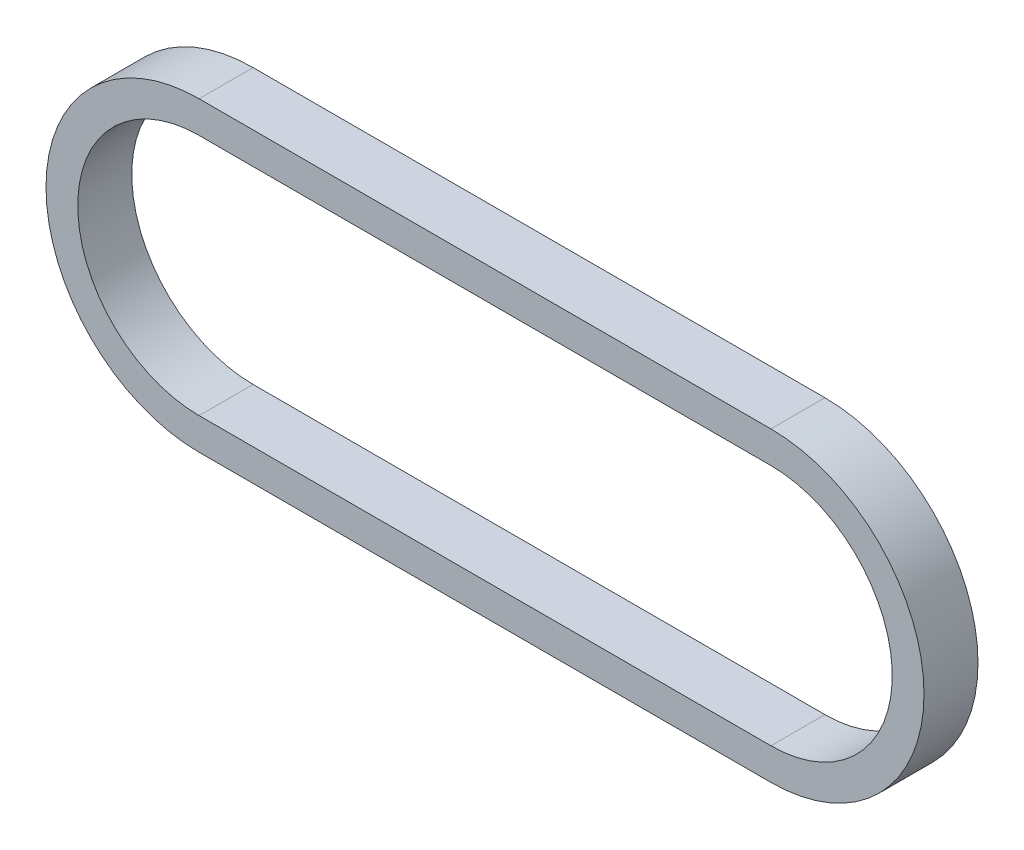
ISO-10303-21;
HEADER;
FILE_DESCRIPTION(('STEP AP214'),'2;1');
FILE_NAME('part.step','',(''),(''),'','','');
FILE_SCHEMA(('AUTOMOTIVE_DESIGN { 1 0 10303 214 1 1 1 1 }'));
ENDSEC;
DATA;
#1=APPLICATION_CONTEXT('core data for automotive mechanical design processes');
#2=APPLICATION_PROTOCOL_DEFINITION('international standard','automotive_design',2000,#1);
#3=PRODUCT_CONTEXT('',#1,'mechanical');
#4=PRODUCT('Part','Part','',(#3));
#5=PRODUCT_RELATED_PRODUCT_CATEGORY('part','',(#4));
#6=PRODUCT_DEFINITION_FORMATION('','',#4);
#7=PRODUCT_DEFINITION_CONTEXT('part definition',#1,'design');
#8=PRODUCT_DEFINITION('design','',#6,#7);
#9=PRODUCT_DEFINITION_SHAPE('','',#8);
#10=(LENGTH_UNIT() NAMED_UNIT(*) SI_UNIT(.MILLI.,.METRE.));
#11=(NAMED_UNIT(*) PLANE_ANGLE_UNIT() SI_UNIT($,.RADIAN.));
#12=(NAMED_UNIT(*) SI_UNIT($,.STERADIAN.) SOLID_ANGLE_UNIT());
#13=UNCERTAINTY_MEASURE_WITH_UNIT(LENGTH_MEASURE(1.E-05),#10,'distance_accuracy_value','');
#14=(GEOMETRIC_REPRESENTATION_CONTEXT(3) GLOBAL_UNCERTAINTY_ASSIGNED_CONTEXT((#13)) GLOBAL_UNIT_ASSIGNED_CONTEXT((#10,
#11,#12)) REPRESENTATION_CONTEXT('',''));
#15=CARTESIAN_POINT('',(0.,0.,0.));
#16=DIRECTION('',(0.,0.,1.));
#17=DIRECTION('',(1.,0.,0.));
#18=AXIS2_PLACEMENT_3D('',#15,#16,#17);
#19=CARTESIAN_POINT('',(-45.01261,0.,4.25));
#20=DIRECTION('',(0.,0.,-1.));
#21=DIRECTION('',(-1.,0.,0.));
#22=AXIS2_PLACEMENT_3D('',#19,#20,#21);
#23=PLANE('',#22);
#24=CARTESIAN_POINT('',(-45.01261,0.,4.25));
#25=DIRECTION('',(0.,0.,-1.));
#26=DIRECTION('',(-1.,0.,0.));
#27=AXIS2_PLACEMENT_3D('',#24,#25,#26);
#28=CIRCLE('',#27,24.1008);
#29=CARTESIAN_POINT('',(-45.01261,24.1008,4.25));
#30=VERTEX_POINT('',#29);
#31=CARTESIAN_POINT('',(-45.01261,-24.1008,4.25));
#32=VERTEX_POINT('',#31);
#33=EDGE_CURVE('E158',#30,#32,#28,.F.);
#34=ORIENTED_EDGE('',*,*,#33,.T.);
#35=DIRECTION('',(1.,0.,0.));
#36=VECTOR('',#35,1.);
#37=CARTESIAN_POINT('',(-45.01261,-24.1008,4.25));
#38=LINE('',#37,#36);
#39=CARTESIAN_POINT('',(45.01261,-24.1008,4.25));
#40=VERTEX_POINT('',#39);
#41=EDGE_CURVE('E161',#32,#40,#38,.T.);
#42=ORIENTED_EDGE('',*,*,#41,.T.);
#43=CARTESIAN_POINT('',(45.01261,0.,4.25));
#44=DIRECTION('',(0.,0.,-1.));
#45=DIRECTION('',(-1.,0.,0.));
#46=AXIS2_PLACEMENT_3D('',#43,#44,#45);
#47=CIRCLE('',#46,24.1008);
#48=CARTESIAN_POINT('',(45.01261,24.1008,4.25));
#49=VERTEX_POINT('',#48);
#50=EDGE_CURVE('E164',#40,#49,#47,.F.);
#51=ORIENTED_EDGE('',*,*,#50,.T.);
#52=DIRECTION('',(-1.,0.,0.));
#53=VECTOR('',#52,1.);
#54=CARTESIAN_POINT('',(-45.01261,24.1008,4.25));
#55=LINE('',#54,#53);
#56=EDGE_CURVE('E166',#49,#30,#55,.T.);
#57=ORIENTED_EDGE('',*,*,#56,.T.);
#58=EDGE_LOOP('',(#34,#42,#51,#57));
#59=FACE_BOUND('',#58,.T.);
#60=CARTESIAN_POINT('',(-45.01261,0.,4.25));
#61=DIRECTION('',(0.,0.,1.));
#62=DIRECTION('',(-1.,0.,0.));
#63=AXIS2_PLACEMENT_3D('',#60,#61,#62);
#64=CIRCLE('',#63,19.1008);
#65=CARTESIAN_POINT('',(-45.01261,19.1008,4.25));
#66=VERTEX_POINT('',#65);
#67=CARTESIAN_POINT('',(-45.01261,-19.1008,4.25));
#68=VERTEX_POINT('',#67);
#69=EDGE_CURVE('E122',#66,#68,#64,.T.);
#70=ORIENTED_EDGE('',*,*,#69,.F.);
#71=DIRECTION('',(-1.,0.,0.));
#72=VECTOR('',#71,1.);
#73=CARTESIAN_POINT('',(-45.01261,19.1008,4.25));
#74=LINE('',#73,#72);
#75=CARTESIAN_POINT('',(45.01261,19.1008,4.25));
#76=VERTEX_POINT('',#75);
#77=EDGE_CURVE('E144',#76,#66,#74,.T.);
#78=ORIENTED_EDGE('',*,*,#77,.F.);
#79=CARTESIAN_POINT('',(45.01261,0.,4.25));
#80=DIRECTION('',(0.,0.,1.));
#81=DIRECTION('',(1.,0.,0.));
#82=AXIS2_PLACEMENT_3D('',#79,#80,#81);
#83=CIRCLE('',#82,19.1008);
#84=CARTESIAN_POINT('',(45.01261,-19.1008,4.25));
#85=VERTEX_POINT('',#84);
#86=EDGE_CURVE('E142',#85,#76,#83,.T.);
#87=ORIENTED_EDGE('',*,*,#86,.F.);
#88=DIRECTION('',(1.,0.,0.));
#89=VECTOR('',#88,1.);
#90=CARTESIAN_POINT('',(-45.01261,-19.1008,4.25));
#91=LINE('',#90,#89);
#92=EDGE_CURVE('E130',#68,#85,#91,.T.);
#93=ORIENTED_EDGE('',*,*,#92,.F.);
#94=EDGE_LOOP('',(#70,#78,#87,#93));
#95=FACE_BOUND('',#94,.T.);
#96=ADVANCED_FACE('F57',(#59,#95),#23,.F.);
#97=CARTESIAN_POINT('',(-45.01261,0.,-4.25));
#98=DIRECTION('',(0.,0.,-1.));
#99=DIRECTION('',(-1.,0.,0.));
#100=AXIS2_PLACEMENT_3D('',#97,#98,#99);
#101=PLANE('',#100);
#102=CARTESIAN_POINT('',(-45.01261,0.,-4.25));
#103=DIRECTION('',(0.,0.,-1.));
#104=DIRECTION('',(-1.,0.,0.));
#105=AXIS2_PLACEMENT_3D('',#102,#103,#104);
#106=CIRCLE('',#105,24.1008);
#107=CARTESIAN_POINT('',(-45.01261,24.1008,-4.25));
#108=VERTEX_POINT('',#107);
#109=CARTESIAN_POINT('',(-45.01261,-24.1008,-4.25));
#110=VERTEX_POINT('',#109);
#111=EDGE_CURVE('E138',#108,#110,#106,.F.);
#112=ORIENTED_EDGE('',*,*,#111,.F.);
#113=DIRECTION('',(-1.,0.,0.));
#114=VECTOR('',#113,1.);
#115=CARTESIAN_POINT('',(-45.01261,24.1008,-4.25));
#116=LINE('',#115,#114);
#117=CARTESIAN_POINT('',(45.01261,24.1008,-4.25));
#118=VERTEX_POINT('',#117);
#119=EDGE_CURVE('E162',#118,#108,#116,.T.);
#120=ORIENTED_EDGE('',*,*,#119,.F.);
#121=CARTESIAN_POINT('',(45.01261,0.,-4.25));
#122=DIRECTION('',(0.,0.,-1.));
#123=DIRECTION('',(-1.,0.,0.));
#124=AXIS2_PLACEMENT_3D('',#121,#122,#123);
#125=CIRCLE('',#124,24.1008);
#126=CARTESIAN_POINT('',(45.01261,-24.1008,-4.25));
#127=VERTEX_POINT('',#126);
#128=EDGE_CURVE('E173',#127,#118,#125,.F.);
#129=ORIENTED_EDGE('',*,*,#128,.F.);
#130=DIRECTION('',(1.,0.,0.));
#131=VECTOR('',#130,1.);
#132=CARTESIAN_POINT('',(-45.01261,-24.1008,-4.25));
#133=LINE('',#132,#131);
#134=EDGE_CURVE('E171',#110,#127,#133,.T.);
#135=ORIENTED_EDGE('',*,*,#134,.F.);
#136=EDGE_LOOP('',(#112,#120,#129,#135));
#137=FACE_BOUND('',#136,.T.);
#138=DIRECTION('',(-1.,0.,0.));
#139=VECTOR('',#138,1.);
#140=CARTESIAN_POINT('',(-45.01261,19.1008,-4.25));
#141=LINE('',#140,#139);
#142=CARTESIAN_POINT('',(45.01261,19.1008,-4.25));
#143=VERTEX_POINT('',#142);
#144=CARTESIAN_POINT('',(-45.01261,19.1008,-4.25));
#145=VERTEX_POINT('',#144);
#146=EDGE_CURVE('E131',#143,#145,#141,.T.);
#147=ORIENTED_EDGE('',*,*,#146,.T.);
#148=CARTESIAN_POINT('',(-45.01261,0.,-4.25));
#149=DIRECTION('',(0.,0.,1.));
#150=DIRECTION('',(-1.,0.,0.));
#151=AXIS2_PLACEMENT_3D('',#148,#149,#150);
#152=CIRCLE('',#151,19.1008);
#153=CARTESIAN_POINT('',(-45.01261,-19.1008,-4.25));
#154=VERTEX_POINT('',#153);
#155=EDGE_CURVE('E80',#145,#154,#152,.T.);
#156=ORIENTED_EDGE('',*,*,#155,.T.);
#157=DIRECTION('',(1.,0.,0.));
#158=VECTOR('',#157,1.);
#159=CARTESIAN_POINT('',(-45.01261,-19.1008,-4.25));
#160=LINE('',#159,#158);
#161=CARTESIAN_POINT('',(45.01261,-19.1008,-4.25));
#162=VERTEX_POINT('',#161);
#163=EDGE_CURVE('E137',#154,#162,#160,.T.);
#164=ORIENTED_EDGE('',*,*,#163,.T.);
#165=CARTESIAN_POINT('',(45.01261,0.,-4.25));
#166=DIRECTION('',(0.,0.,1.));
#167=DIRECTION('',(1.,0.,0.));
#168=AXIS2_PLACEMENT_3D('',#165,#166,#167);
#169=CIRCLE('',#168,19.1008);
#170=EDGE_CURVE('E150',#162,#143,#169,.T.);
#171=ORIENTED_EDGE('',*,*,#170,.T.);
#172=EDGE_LOOP('',(#147,#156,#164,#171));
#173=FACE_BOUND('',#172,.T.);
#174=ADVANCED_FACE('F191',(#137,#173),#101,.T.);
#175=CARTESIAN_POINT('',(-45.01261,0.,4.25));
#176=DIRECTION('',(0.,0.,-1.));
#177=DIRECTION('',(-1.,0.,0.));
#178=AXIS2_PLACEMENT_3D('',#175,#176,#177);
#179=CYLINDRICAL_SURFACE('',#178,24.1008);
#180=ORIENTED_EDGE('',*,*,#111,.T.);
#181=DIRECTION('',(0.,0.,-1.));
#182=VECTOR('',#181,1.);
#183=CARTESIAN_POINT('',(-45.01261,-24.1008,4.25));
#184=LINE('',#183,#182);
#185=EDGE_CURVE('E12',#32,#110,#184,.T.);
#186=ORIENTED_EDGE('',*,*,#185,.F.);
#187=ORIENTED_EDGE('',*,*,#33,.F.);
#188=DIRECTION('',(0.,0.,-1.));
#189=VECTOR('',#188,1.);
#190=CARTESIAN_POINT('',(-45.01261,24.1008,4.25));
#191=LINE('',#190,#189);
#192=EDGE_CURVE('E168',#30,#108,#191,.T.);
#193=ORIENTED_EDGE('',*,*,#192,.T.);
#194=EDGE_LOOP('',(#180,#186,#187,#193));
#195=FACE_BOUND('',#194,.T.);
#196=ADVANCED_FACE('F59',(#195),#179,.T.);
#197=CARTESIAN_POINT('',(-45.01261,-24.1008,4.25));
#198=DIRECTION('',(0.,1.,0.));
#199=DIRECTION('',(-1.,0.,0.));
#200=AXIS2_PLACEMENT_3D('',#197,#198,#199);
#201=PLANE('',#200);
#202=ORIENTED_EDGE('',*,*,#134,.T.);
#203=DIRECTION('',(0.,0.,-1.));
#204=VECTOR('',#203,1.);
#205=CARTESIAN_POINT('',(45.01261,-24.1008,4.25));
#206=LINE('',#205,#204);
#207=EDGE_CURVE('E65',#40,#127,#206,.T.);
#208=ORIENTED_EDGE('',*,*,#207,.F.);
#209=ORIENTED_EDGE('',*,*,#41,.F.);
#210=ORIENTED_EDGE('',*,*,#185,.T.);
#211=EDGE_LOOP('',(#202,#208,#209,#210));
#212=FACE_BOUND('',#211,.T.);
#213=ADVANCED_FACE('F201',(#212),#201,.F.);
#214=CARTESIAN_POINT('',(45.01261,0.,4.25));
#215=DIRECTION('',(0.,0.,-1.));
#216=DIRECTION('',(-1.,0.,0.));
#217=AXIS2_PLACEMENT_3D('',#214,#215,#216);
#218=CYLINDRICAL_SURFACE('',#217,24.1008);
#219=ORIENTED_EDGE('',*,*,#128,.T.);
#220=DIRECTION('',(0.,0.,-1.));
#221=VECTOR('',#220,1.);
#222=CARTESIAN_POINT('',(45.01261,24.1008,4.25));
#223=LINE('',#222,#221);
#224=EDGE_CURVE('E178',#49,#118,#223,.T.);
#225=ORIENTED_EDGE('',*,*,#224,.F.);
#226=ORIENTED_EDGE('',*,*,#50,.F.);
#227=ORIENTED_EDGE('',*,*,#207,.T.);
#228=EDGE_LOOP('',(#219,#225,#226,#227));
#229=FACE_BOUND('',#228,.T.);
#230=ADVANCED_FACE('F185',(#229),#218,.T.);
#231=CARTESIAN_POINT('',(-45.01261,24.1008,4.25));
#232=DIRECTION('',(0.,-1.,0.));
#233=DIRECTION('',(1.,0.,0.));
#234=AXIS2_PLACEMENT_3D('',#231,#232,#233);
#235=PLANE('',#234);
#236=ORIENTED_EDGE('',*,*,#119,.T.);
#237=ORIENTED_EDGE('',*,*,#192,.F.);
#238=ORIENTED_EDGE('',*,*,#56,.F.);
#239=ORIENTED_EDGE('',*,*,#224,.T.);
#240=EDGE_LOOP('',(#236,#237,#238,#239));
#241=FACE_BOUND('',#240,.T.);
#242=ADVANCED_FACE('F195',(#241),#235,.F.);
#243=CARTESIAN_POINT('',(-45.01261,0.,4.25));
#244=DIRECTION('',(0.,0.,-1.));
#245=DIRECTION('',(-1.,0.,0.));
#246=AXIS2_PLACEMENT_3D('',#243,#244,#245);
#247=CYLINDRICAL_SURFACE('',#246,19.1008);
#248=ORIENTED_EDGE('',*,*,#155,.F.);
#249=DIRECTION('',(0.,0.,-1.));
#250=VECTOR('',#249,1.);
#251=CARTESIAN_POINT('',(-45.01261,19.1008,4.25));
#252=LINE('',#251,#250);
#253=EDGE_CURVE('E126',#66,#145,#252,.T.);
#254=ORIENTED_EDGE('',*,*,#253,.F.);
#255=ORIENTED_EDGE('',*,*,#69,.T.);
#256=DIRECTION('',(0.,0.,-1.));
#257=VECTOR('',#256,1.);
#258=CARTESIAN_POINT('',(-45.01261,-19.1008,4.25));
#259=LINE('',#258,#257);
#260=EDGE_CURVE('E125',#68,#154,#259,.T.);
#261=ORIENTED_EDGE('',*,*,#260,.T.);
#262=EDGE_LOOP('',(#248,#254,#255,#261));
#263=FACE_BOUND('',#262,.T.);
#264=ADVANCED_FACE('F124',(#263),#247,.F.);
#265=CARTESIAN_POINT('',(-45.01261,-19.1008,4.25));
#266=DIRECTION('',(0.,1.,0.));
#267=DIRECTION('',(-1.,0.,0.));
#268=AXIS2_PLACEMENT_3D('',#265,#266,#267);
#269=PLANE('',#268);
#270=ORIENTED_EDGE('',*,*,#163,.F.);
#271=ORIENTED_EDGE('',*,*,#260,.F.);
#272=ORIENTED_EDGE('',*,*,#92,.T.);
#273=DIRECTION('',(0.,0.,-1.));
#274=VECTOR('',#273,1.);
#275=CARTESIAN_POINT('',(45.01261,-19.1008,4.25));
#276=LINE('',#275,#274);
#277=EDGE_CURVE('E139',#85,#162,#276,.T.);
#278=ORIENTED_EDGE('',*,*,#277,.T.);
#279=EDGE_LOOP('',(#270,#271,#272,#278));
#280=FACE_BOUND('',#279,.T.);
#281=ADVANCED_FACE('F134',(#280),#269,.T.);
#282=CARTESIAN_POINT('',(45.01261,0.,4.25));
#283=DIRECTION('',(0.,0.,-1.));
#284=DIRECTION('',(-1.,0.,0.));
#285=AXIS2_PLACEMENT_3D('',#282,#283,#284);
#286=CYLINDRICAL_SURFACE('',#285,19.1008);
#287=ORIENTED_EDGE('',*,*,#170,.F.);
#288=ORIENTED_EDGE('',*,*,#277,.F.);
#289=ORIENTED_EDGE('',*,*,#86,.T.);
#290=DIRECTION('',(0.,0.,-1.));
#291=VECTOR('',#290,1.);
#292=CARTESIAN_POINT('',(45.01261,19.1008,4.25));
#293=LINE('',#292,#291);
#294=EDGE_CURVE('E72',#76,#143,#293,.T.);
#295=ORIENTED_EDGE('',*,*,#294,.T.);
#296=EDGE_LOOP('',(#287,#288,#289,#295));
#297=FACE_BOUND('',#296,.T.);
#298=ADVANCED_FACE('F224',(#297),#286,.F.);
#299=CARTESIAN_POINT('',(-45.01261,19.1008,4.25));
#300=DIRECTION('',(0.,-1.,0.));
#301=DIRECTION('',(1.,0.,0.));
#302=AXIS2_PLACEMENT_3D('',#299,#300,#301);
#303=PLANE('',#302);
#304=ORIENTED_EDGE('',*,*,#146,.F.);
#305=ORIENTED_EDGE('',*,*,#294,.F.);
#306=ORIENTED_EDGE('',*,*,#77,.T.);
#307=ORIENTED_EDGE('',*,*,#253,.T.);
#308=EDGE_LOOP('',(#304,#305,#306,#307));
#309=FACE_BOUND('',#308,.T.);
#310=ADVANCED_FACE('F228',(#309),#303,.T.);
#311=CLOSED_SHELL('',(#96,#174,#196,#213,#230,#242,#264,#281,#298,#310));
#312=MANIFOLD_SOLID_BREP('B2',#311);
#313=ADVANCED_BREP_SHAPE_REPRESENTATION('',(#18,#312),#14);
#314=SHAPE_DEFINITION_REPRESENTATION(#9,#313);
ENDSEC;
END-ISO-10303-21;
